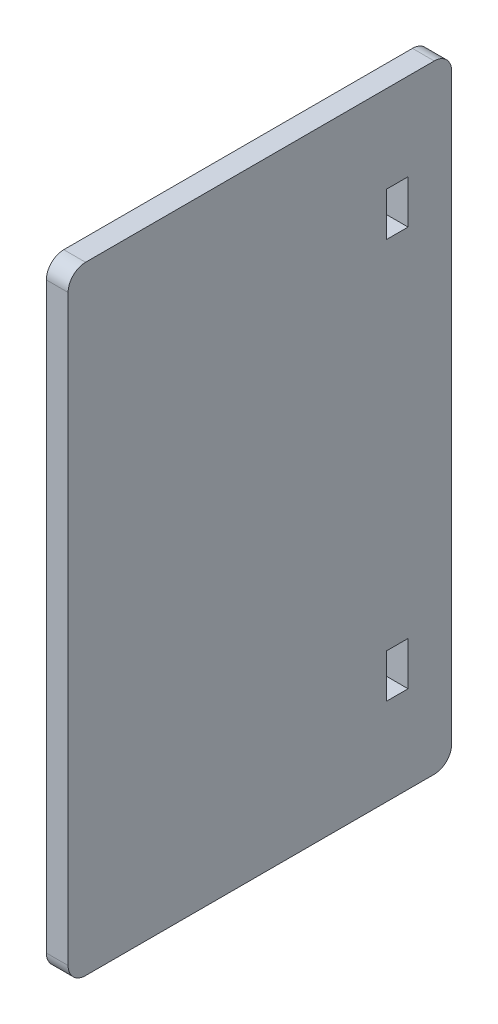
ISO-10303-21;
HEADER;
FILE_DESCRIPTION(('STEP AP214'),'2;1');
FILE_NAME('part.step','',(''),(''),'','','');
FILE_SCHEMA(('AUTOMOTIVE_DESIGN { 1 0 10303 214 1 1 1 1 }'));
ENDSEC;
DATA;
#1=APPLICATION_CONTEXT('core data for automotive mechanical design processes');
#2=APPLICATION_PROTOCOL_DEFINITION('international standard','automotive_design',2000,#1);
#3=PRODUCT_CONTEXT('',#1,'mechanical');
#4=PRODUCT('Part','Part','',(#3));
#5=PRODUCT_RELATED_PRODUCT_CATEGORY('part','',(#4));
#6=PRODUCT_DEFINITION_FORMATION('','',#4);
#7=PRODUCT_DEFINITION_CONTEXT('part definition',#1,'design');
#8=PRODUCT_DEFINITION('design','',#6,#7);
#9=PRODUCT_DEFINITION_SHAPE('','',#8);
#10=(LENGTH_UNIT() NAMED_UNIT(*) SI_UNIT(.MILLI.,.METRE.));
#11=(NAMED_UNIT(*) PLANE_ANGLE_UNIT() SI_UNIT($,.RADIAN.));
#12=(NAMED_UNIT(*) SI_UNIT($,.STERADIAN.) SOLID_ANGLE_UNIT());
#13=UNCERTAINTY_MEASURE_WITH_UNIT(LENGTH_MEASURE(1.E-05),#10,'distance_accuracy_value','');
#14=(GEOMETRIC_REPRESENTATION_CONTEXT(3) GLOBAL_UNCERTAINTY_ASSIGNED_CONTEXT((#13)) GLOBAL_UNIT_ASSIGNED_CONTEXT((#10,
#11,#12)) REPRESENTATION_CONTEXT('',''));
#15=CARTESIAN_POINT('',(0.,0.,0.));
#16=DIRECTION('',(0.,0.,1.));
#17=DIRECTION('',(1.,0.,0.));
#18=AXIS2_PLACEMENT_3D('',#15,#16,#17);
#19=CARTESIAN_POINT('',(3.175,-45.,27.9375));
#20=DIRECTION('',(0.,0.,-1.));
#21=DIRECTION('',(-1.,0.,0.));
#22=AXIS2_PLACEMENT_3D('',#19,#20,#21);
#23=PLANE('',#22);
#24=DIRECTION('',(0.,-1.,0.));
#25=VECTOR('',#24,1.);
#26=CARTESIAN_POINT('',(0.,-45.,27.9375));
#27=LINE('',#26,#25);
#28=CARTESIAN_POINT('',(0.,42.46,27.9375));
#29=VERTEX_POINT('',#28);
#30=CARTESIAN_POINT('',(0.,-42.46,27.9375));
#31=VERTEX_POINT('',#30);
#32=EDGE_CURVE('E195',#29,#31,#27,.T.);
#33=ORIENTED_EDGE('',*,*,#32,.T.);
#34=DIRECTION('',(-1.,0.,0.));
#35=VECTOR('',#34,1.);
#36=CARTESIAN_POINT('',(3.175,-42.46,27.9375));
#37=LINE('',#36,#35);
#38=CARTESIAN_POINT('',(3.175,-42.46,27.9375));
#39=VERTEX_POINT('',#38);
#40=EDGE_CURVE('E266',#31,#39,#37,.F.);
#41=ORIENTED_EDGE('',*,*,#40,.T.);
#42=DIRECTION('',(0.,-1.,0.));
#43=VECTOR('',#42,1.);
#44=CARTESIAN_POINT('',(3.175,-45.,27.9375));
#45=LINE('',#44,#43);
#46=CARTESIAN_POINT('',(3.175,42.46,27.9375));
#47=VERTEX_POINT('',#46);
#48=EDGE_CURVE('E230',#47,#39,#45,.T.);
#49=ORIENTED_EDGE('',*,*,#48,.F.);
#50=DIRECTION('',(-1.,0.,0.));
#51=VECTOR('',#50,1.);
#52=CARTESIAN_POINT('',(3.175,42.46,27.9375));
#53=LINE('',#52,#51);
#54=EDGE_CURVE('E263',#47,#29,#53,.T.);
#55=ORIENTED_EDGE('',*,*,#54,.T.);
#56=EDGE_LOOP('',(#33,#41,#49,#55));
#57=FACE_BOUND('',#56,.T.);
#58=ADVANCED_FACE('F40',(#57),#23,.F.);
#59=CARTESIAN_POINT('',(3.175,-45.,-27.9375));
#60=DIRECTION('',(0.,1.,0.));
#61=DIRECTION('',(0.,0.,1.));
#62=AXIS2_PLACEMENT_3D('',#59,#60,#61);
#63=PLANE('',#62);
#64=DIRECTION('',(0.,0.,-1.));
#65=VECTOR('',#64,1.);
#66=CARTESIAN_POINT('',(3.175,-45.,-27.9375));
#67=LINE('',#66,#65);
#68=CARTESIAN_POINT('',(3.175,-45.,25.3975));
#69=VERTEX_POINT('',#68);
#70=CARTESIAN_POINT('',(3.175,-45.,-25.3975));
#71=VERTEX_POINT('',#70);
#72=EDGE_CURVE('E233',#69,#71,#67,.T.);
#73=ORIENTED_EDGE('',*,*,#72,.F.);
#74=DIRECTION('',(-1.,0.,0.));
#75=VECTOR('',#74,1.);
#76=CARTESIAN_POINT('',(3.175,-45.,25.3975));
#77=LINE('',#76,#75);
#78=CARTESIAN_POINT('',(0.,-45.,25.3975));
#79=VERTEX_POINT('',#78);
#80=EDGE_CURVE('E252',#69,#79,#77,.T.);
#81=ORIENTED_EDGE('',*,*,#80,.T.);
#82=DIRECTION('',(0.,0.,-1.));
#83=VECTOR('',#82,1.);
#84=CARTESIAN_POINT('',(0.,-45.,-27.9375));
#85=LINE('',#84,#83);
#86=CARTESIAN_POINT('',(0.,-45.,-25.3975));
#87=VERTEX_POINT('',#86);
#88=EDGE_CURVE('E244',#79,#87,#85,.T.);
#89=ORIENTED_EDGE('',*,*,#88,.T.);
#90=DIRECTION('',(-1.,0.,0.));
#91=VECTOR('',#90,1.);
#92=CARTESIAN_POINT('',(3.175,-45.,-25.3975));
#93=LINE('',#92,#91);
#94=EDGE_CURVE('E241',#87,#71,#93,.F.);
#95=ORIENTED_EDGE('',*,*,#94,.T.);
#96=EDGE_LOOP('',(#73,#81,#89,#95));
#97=FACE_BOUND('',#96,.T.);
#98=ADVANCED_FACE('F308',(#97),#63,.F.);
#99=CARTESIAN_POINT('',(3.175,-45.,-27.9375));
#100=DIRECTION('',(0.,0.,1.));
#101=DIRECTION('',(1.,0.,0.));
#102=AXIS2_PLACEMENT_3D('',#99,#100,#101);
#103=PLANE('',#102);
#104=DIRECTION('',(0.,1.,0.));
#105=VECTOR('',#104,1.);
#106=CARTESIAN_POINT('',(3.175,-45.,-27.9375));
#107=LINE('',#106,#105);
#108=CARTESIAN_POINT('',(3.175,-42.46,-27.9375));
#109=VERTEX_POINT('',#108);
#110=CARTESIAN_POINT('',(3.175,42.46,-27.9375));
#111=VERTEX_POINT('',#110);
#112=EDGE_CURVE('E237',#109,#111,#107,.T.);
#113=ORIENTED_EDGE('',*,*,#112,.F.);
#114=DIRECTION('',(-1.,0.,0.));
#115=VECTOR('',#114,1.);
#116=CARTESIAN_POINT('',(3.175,-42.46,-27.9375));
#117=LINE('',#116,#115);
#118=CARTESIAN_POINT('',(0.,-42.46,-27.9375));
#119=VERTEX_POINT('',#118);
#120=EDGE_CURVE('E277',#109,#119,#117,.T.);
#121=ORIENTED_EDGE('',*,*,#120,.T.);
#122=DIRECTION('',(0.,1.,0.));
#123=VECTOR('',#122,1.);
#124=CARTESIAN_POINT('',(0.,-45.,-27.9375));
#125=LINE('',#124,#123);
#126=CARTESIAN_POINT('',(0.,42.46,-27.9375));
#127=VERTEX_POINT('',#126);
#128=EDGE_CURVE('E247',#119,#127,#125,.T.);
#129=ORIENTED_EDGE('',*,*,#128,.T.);
#130=DIRECTION('',(-1.,0.,0.));
#131=VECTOR('',#130,1.);
#132=CARTESIAN_POINT('',(3.175,42.46,-27.9375));
#133=LINE('',#132,#131);
#134=EDGE_CURVE('E275',#127,#111,#133,.F.);
#135=ORIENTED_EDGE('',*,*,#134,.T.);
#136=EDGE_LOOP('',(#113,#121,#129,#135));
#137=FACE_BOUND('',#136,.T.);
#138=ADVANCED_FACE('F283',(#137),#103,.F.);
#139=CARTESIAN_POINT('',(3.175,45.,-27.9375));
#140=DIRECTION('',(0.,-1.,0.));
#141=DIRECTION('',(0.,0.,-1.));
#142=AXIS2_PLACEMENT_3D('',#139,#140,#141);
#143=PLANE('',#142);
#144=DIRECTION('',(0.,0.,1.));
#145=VECTOR('',#144,1.);
#146=CARTESIAN_POINT('',(3.175,45.,-27.9375));
#147=LINE('',#146,#145);
#148=CARTESIAN_POINT('',(3.175,45.,-25.3975));
#149=VERTEX_POINT('',#148);
#150=CARTESIAN_POINT('',(3.175,45.,25.3975));
#151=VERTEX_POINT('',#150);
#152=EDGE_CURVE('E239',#149,#151,#147,.T.);
#153=ORIENTED_EDGE('',*,*,#152,.F.);
#154=DIRECTION('',(-1.,0.,0.));
#155=VECTOR('',#154,1.);
#156=CARTESIAN_POINT('',(3.175,45.,-25.3975));
#157=LINE('',#156,#155);
#158=CARTESIAN_POINT('',(0.,45.,-25.3975));
#159=VERTEX_POINT('',#158);
#160=EDGE_CURVE('E11',#149,#159,#157,.T.);
#161=ORIENTED_EDGE('',*,*,#160,.T.);
#162=DIRECTION('',(0.,0.,1.));
#163=VECTOR('',#162,1.);
#164=CARTESIAN_POINT('',(0.,45.,-27.9375));
#165=LINE('',#164,#163);
#166=CARTESIAN_POINT('',(0.,45.,25.3975));
#167=VERTEX_POINT('',#166);
#168=EDGE_CURVE('E234',#159,#167,#165,.T.);
#169=ORIENTED_EDGE('',*,*,#168,.T.);
#170=DIRECTION('',(-1.,0.,0.));
#171=VECTOR('',#170,1.);
#172=CARTESIAN_POINT('',(3.175,45.,25.3975));
#173=LINE('',#172,#171);
#174=EDGE_CURVE('E48',#167,#151,#173,.F.);
#175=ORIENTED_EDGE('',*,*,#174,.T.);
#176=EDGE_LOOP('',(#153,#161,#169,#175));
#177=FACE_BOUND('',#176,.T.);
#178=ADVANCED_FACE('F293',(#177),#143,.F.);
#179=CARTESIAN_POINT('',(3.175,0.,0.));
#180=DIRECTION('',(1.,0.,0.));
#181=DIRECTION('',(0.,0.,-1.));
#182=AXIS2_PLACEMENT_3D('',#179,#180,#181);
#183=PLANE('',#182);
#184=DIRECTION('',(0.,-1.,0.));
#185=VECTOR('',#184,1.);
#186=CARTESIAN_POINT('',(3.175,32.3,-18.4125));
#187=LINE('',#186,#185);
#188=CARTESIAN_POINT('',(3.175,32.3,-18.4125));
#189=VERTEX_POINT('',#188);
#190=CARTESIAN_POINT('',(3.175,25.95,-18.4125));
#191=VERTEX_POINT('',#190);
#192=EDGE_CURVE('E161',#189,#191,#187,.T.);
#193=ORIENTED_EDGE('',*,*,#192,.F.);
#194=DIRECTION('',(0.,0.,1.));
#195=VECTOR('',#194,1.);
#196=CARTESIAN_POINT('',(3.175,32.3,-18.4125));
#197=LINE('',#196,#195);
#198=CARTESIAN_POINT('',(3.175,32.3,-21.5875));
#199=VERTEX_POINT('',#198);
#200=EDGE_CURVE('E179',#199,#189,#197,.T.);
#201=ORIENTED_EDGE('',*,*,#200,.F.);
#202=DIRECTION('',(0.,1.,0.));
#203=VECTOR('',#202,1.);
#204=CARTESIAN_POINT('',(3.175,32.3,-21.5875));
#205=LINE('',#204,#203);
#206=CARTESIAN_POINT('',(3.175,25.95,-21.5875));
#207=VERTEX_POINT('',#206);
#208=EDGE_CURVE('E182',#207,#199,#205,.T.);
#209=ORIENTED_EDGE('',*,*,#208,.F.);
#210=DIRECTION('',(0.,0.,-1.));
#211=VECTOR('',#210,1.);
#212=CARTESIAN_POINT('',(3.175,25.95,-18.4125));
#213=LINE('',#212,#211);
#214=EDGE_CURVE('E188',#191,#207,#213,.T.);
#215=ORIENTED_EDGE('',*,*,#214,.F.);
#216=EDGE_LOOP('',(#193,#201,#209,#215));
#217=FACE_BOUND('',#216,.T.);
#218=DIRECTION('',(0.,-1.,0.));
#219=VECTOR('',#218,1.);
#220=CARTESIAN_POINT('',(3.175,-25.95,-18.4125));
#221=LINE('',#220,#219);
#222=CARTESIAN_POINT('',(3.175,-25.95,-18.4125));
#223=VERTEX_POINT('',#222);
#224=CARTESIAN_POINT('',(3.175,-32.3,-18.4125));
#225=VERTEX_POINT('',#224);
#226=EDGE_CURVE('E189',#223,#225,#221,.T.);
#227=ORIENTED_EDGE('',*,*,#226,.F.);
#228=DIRECTION('',(0.,0.,1.));
#229=VECTOR('',#228,1.);
#230=CARTESIAN_POINT('',(3.175,-25.95,-18.4125));
#231=LINE('',#230,#229);
#232=CARTESIAN_POINT('',(3.175,-25.95,-21.5875));
#233=VERTEX_POINT('',#232);
#234=EDGE_CURVE('E209',#233,#223,#231,.T.);
#235=ORIENTED_EDGE('',*,*,#234,.F.);
#236=DIRECTION('',(0.,1.,0.));
#237=VECTOR('',#236,1.);
#238=CARTESIAN_POINT('',(3.175,-25.95,-21.5875));
#239=LINE('',#238,#237);
#240=CARTESIAN_POINT('',(3.175,-32.3,-21.5875));
#241=VERTEX_POINT('',#240);
#242=EDGE_CURVE('E212',#241,#233,#239,.T.);
#243=ORIENTED_EDGE('',*,*,#242,.F.);
#244=DIRECTION('',(0.,0.,-1.));
#245=VECTOR('',#244,1.);
#246=CARTESIAN_POINT('',(3.175,-32.3,-18.4125));
#247=LINE('',#246,#245);
#248=EDGE_CURVE('E216',#225,#241,#247,.T.);
#249=ORIENTED_EDGE('',*,*,#248,.F.);
#250=EDGE_LOOP('',(#227,#235,#243,#249));
#251=FACE_BOUND('',#250,.T.);
#252=ORIENTED_EDGE('',*,*,#48,.T.);
#253=CARTESIAN_POINT('',(3.175,-42.46,25.3975));
#254=DIRECTION('',(1.,0.,0.));
#255=DIRECTION('',(0.,0.,-1.));
#256=AXIS2_PLACEMENT_3D('',#253,#254,#255);
#257=CIRCLE('',#256,2.54);
#258=EDGE_CURVE('E273',#39,#69,#257,.T.);
#259=ORIENTED_EDGE('',*,*,#258,.T.);
#260=ORIENTED_EDGE('',*,*,#72,.T.);
#261=CARTESIAN_POINT('',(3.175,-42.46,-25.3975));
#262=DIRECTION('',(1.,0.,0.));
#263=DIRECTION('',(0.,0.,-1.));
#264=AXIS2_PLACEMENT_3D('',#261,#262,#263);
#265=CIRCLE('',#264,2.54);
#266=EDGE_CURVE('E271',#71,#109,#265,.T.);
#267=ORIENTED_EDGE('',*,*,#266,.T.);
#268=ORIENTED_EDGE('',*,*,#112,.T.);
#269=CARTESIAN_POINT('',(3.175,42.46,-25.3975));
#270=DIRECTION('',(1.,0.,0.));
#271=DIRECTION('',(0.,0.,-1.));
#272=AXIS2_PLACEMENT_3D('',#269,#270,#271);
#273=CIRCLE('',#272,2.54);
#274=EDGE_CURVE('E61',#111,#149,#273,.T.);
#275=ORIENTED_EDGE('',*,*,#274,.T.);
#276=ORIENTED_EDGE('',*,*,#152,.T.);
#277=CARTESIAN_POINT('',(3.175,42.46,25.3975));
#278=DIRECTION('',(1.,0.,0.));
#279=DIRECTION('',(0.,0.,-1.));
#280=AXIS2_PLACEMENT_3D('',#277,#278,#279);
#281=CIRCLE('',#280,2.54);
#282=EDGE_CURVE('E268',#151,#47,#281,.T.);
#283=ORIENTED_EDGE('',*,*,#282,.T.);
#284=EDGE_LOOP('',(#252,#259,#260,#267,#268,#275,#276,#283));
#285=FACE_BOUND('',#284,.T.);
#286=ADVANCED_FACE('F295',(#217,#251,#285),#183,.T.);
#287=CARTESIAN_POINT('',(0.,0.,0.));
#288=DIRECTION('',(1.,0.,0.));
#289=DIRECTION('',(0.,0.,-1.));
#290=AXIS2_PLACEMENT_3D('',#287,#288,#289);
#291=PLANE('',#290);
#292=DIRECTION('',(0.,0.,1.));
#293=VECTOR('',#292,1.);
#294=CARTESIAN_POINT('',(0.,32.3,-18.4125));
#295=LINE('',#294,#293);
#296=CARTESIAN_POINT('',(0.,32.3,-21.5875));
#297=VERTEX_POINT('',#296);
#298=CARTESIAN_POINT('',(0.,32.3,-18.4125));
#299=VERTEX_POINT('',#298);
#300=EDGE_CURVE('E166',#297,#299,#295,.T.);
#301=ORIENTED_EDGE('',*,*,#300,.T.);
#302=DIRECTION('',(0.,-1.,0.));
#303=VECTOR('',#302,1.);
#304=CARTESIAN_POINT('',(0.,32.3,-18.4125));
#305=LINE('',#304,#303);
#306=CARTESIAN_POINT('',(0.,25.95,-18.4125));
#307=VERTEX_POINT('',#306);
#308=EDGE_CURVE('E158',#299,#307,#305,.T.);
#309=ORIENTED_EDGE('',*,*,#308,.T.);
#310=DIRECTION('',(0.,0.,-1.));
#311=VECTOR('',#310,1.);
#312=CARTESIAN_POINT('',(0.,25.95,-18.4125));
#313=LINE('',#312,#311);
#314=CARTESIAN_POINT('',(0.,25.95,-21.5875));
#315=VERTEX_POINT('',#314);
#316=EDGE_CURVE('E170',#307,#315,#313,.T.);
#317=ORIENTED_EDGE('',*,*,#316,.T.);
#318=DIRECTION('',(0.,1.,0.));
#319=VECTOR('',#318,1.);
#320=CARTESIAN_POINT('',(0.,32.3,-21.5875));
#321=LINE('',#320,#319);
#322=EDGE_CURVE('E174',#315,#297,#321,.T.);
#323=ORIENTED_EDGE('',*,*,#322,.T.);
#324=EDGE_LOOP('',(#301,#309,#317,#323));
#325=FACE_BOUND('',#324,.T.);
#326=DIRECTION('',(0.,0.,1.));
#327=VECTOR('',#326,1.);
#328=CARTESIAN_POINT('',(0.,-25.95,-18.4125));
#329=LINE('',#328,#327);
#330=CARTESIAN_POINT('',(0.,-25.95,-21.5875));
#331=VERTEX_POINT('',#330);
#332=CARTESIAN_POINT('',(0.,-25.95,-18.4125));
#333=VERTEX_POINT('',#332);
#334=EDGE_CURVE('E202',#331,#333,#329,.T.);
#335=ORIENTED_EDGE('',*,*,#334,.T.);
#336=DIRECTION('',(0.,-1.,0.));
#337=VECTOR('',#336,1.);
#338=CARTESIAN_POINT('',(0.,-25.95,-18.4125));
#339=LINE('',#338,#337);
#340=CARTESIAN_POINT('',(0.,-32.3,-18.4125));
#341=VERTEX_POINT('',#340);
#342=EDGE_CURVE('E213',#333,#341,#339,.T.);
#343=ORIENTED_EDGE('',*,*,#342,.T.);
#344=DIRECTION('',(0.,0.,-1.));
#345=VECTOR('',#344,1.);
#346=CARTESIAN_POINT('',(0.,-32.3,-18.4125));
#347=LINE('',#346,#345);
#348=CARTESIAN_POINT('',(0.,-32.3,-21.5875));
#349=VERTEX_POINT('',#348);
#350=EDGE_CURVE('E225',#341,#349,#347,.T.);
#351=ORIENTED_EDGE('',*,*,#350,.T.);
#352=DIRECTION('',(0.,1.,0.));
#353=VECTOR('',#352,1.);
#354=CARTESIAN_POINT('',(0.,-25.95,-21.5875));
#355=LINE('',#354,#353);
#356=EDGE_CURVE('E222',#349,#331,#355,.T.);
#357=ORIENTED_EDGE('',*,*,#356,.T.);
#358=EDGE_LOOP('',(#335,#343,#351,#357));
#359=FACE_BOUND('',#358,.T.);
#360=ORIENTED_EDGE('',*,*,#88,.F.);
#361=CARTESIAN_POINT('',(0.,-42.46,25.3975));
#362=DIRECTION('',(1.,0.,0.));
#363=DIRECTION('',(0.,0.,-1.));
#364=AXIS2_PLACEMENT_3D('',#361,#362,#363);
#365=CIRCLE('',#364,2.54);
#366=EDGE_CURVE('E261',#79,#31,#365,.F.);
#367=ORIENTED_EDGE('',*,*,#366,.T.);
#368=ORIENTED_EDGE('',*,*,#32,.F.);
#369=CARTESIAN_POINT('',(0.,42.46,25.3975));
#370=DIRECTION('',(1.,0.,0.));
#371=DIRECTION('',(0.,0.,-1.));
#372=AXIS2_PLACEMENT_3D('',#369,#370,#371);
#373=CIRCLE('',#372,2.54);
#374=EDGE_CURVE('E255',#29,#167,#373,.F.);
#375=ORIENTED_EDGE('',*,*,#374,.T.);
#376=ORIENTED_EDGE('',*,*,#168,.F.);
#377=CARTESIAN_POINT('',(0.,42.46,-25.3975));
#378=DIRECTION('',(1.,0.,0.));
#379=DIRECTION('',(0.,0.,-1.));
#380=AXIS2_PLACEMENT_3D('',#377,#378,#379);
#381=CIRCLE('',#380,2.54);
#382=EDGE_CURVE('E257',#159,#127,#381,.F.);
#383=ORIENTED_EDGE('',*,*,#382,.T.);
#384=ORIENTED_EDGE('',*,*,#128,.F.);
#385=CARTESIAN_POINT('',(0.,-42.46,-25.3975));
#386=DIRECTION('',(1.,0.,0.));
#387=DIRECTION('',(0.,0.,-1.));
#388=AXIS2_PLACEMENT_3D('',#385,#386,#387);
#389=CIRCLE('',#388,2.54);
#390=EDGE_CURVE('E259',#119,#87,#389,.F.);
#391=ORIENTED_EDGE('',*,*,#390,.T.);
#392=EDGE_LOOP('',(#360,#367,#368,#375,#376,#383,#384,#391));
#393=FACE_BOUND('',#392,.T.);
#394=ADVANCED_FACE('F176',(#325,#359,#393),#291,.F.);
#395=CARTESIAN_POINT('',(0.,-25.95,-18.4125));
#396=DIRECTION('',(0.,0.,1.));
#397=DIRECTION('',(1.,0.,0.));
#398=AXIS2_PLACEMENT_3D('',#395,#396,#397);
#399=PLANE('',#398);
#400=ORIENTED_EDGE('',*,*,#226,.T.);
#401=DIRECTION('',(1.,0.,0.));
#402=VECTOR('',#401,1.);
#403=CARTESIAN_POINT('',(0.,-32.3,-18.4125));
#404=LINE('',#403,#402);
#405=EDGE_CURVE('E199',#341,#225,#404,.T.);
#406=ORIENTED_EDGE('',*,*,#405,.F.);
#407=ORIENTED_EDGE('',*,*,#342,.F.);
#408=DIRECTION('',(1.,0.,0.));
#409=VECTOR('',#408,1.);
#410=CARTESIAN_POINT('',(0.,-25.95,-18.4125));
#411=LINE('',#410,#409);
#412=EDGE_CURVE('E207',#333,#223,#411,.T.);
#413=ORIENTED_EDGE('',*,*,#412,.T.);
#414=EDGE_LOOP('',(#400,#406,#407,#413));
#415=FACE_BOUND('',#414,.T.);
#416=ADVANCED_FACE('F331',(#415),#399,.F.);
#417=CARTESIAN_POINT('',(0.,-25.95,-18.4125));
#418=DIRECTION('',(0.,1.,0.));
#419=DIRECTION('',(0.,0.,1.));
#420=AXIS2_PLACEMENT_3D('',#417,#418,#419);
#421=PLANE('',#420);
#422=ORIENTED_EDGE('',*,*,#234,.T.);
#423=ORIENTED_EDGE('',*,*,#412,.F.);
#424=ORIENTED_EDGE('',*,*,#334,.F.);
#425=DIRECTION('',(1.,0.,0.));
#426=VECTOR('',#425,1.);
#427=CARTESIAN_POINT('',(0.,-25.95,-21.5875));
#428=LINE('',#427,#426);
#429=EDGE_CURVE('E205',#331,#233,#428,.T.);
#430=ORIENTED_EDGE('',*,*,#429,.T.);
#431=EDGE_LOOP('',(#422,#423,#424,#430));
#432=FACE_BOUND('',#431,.T.);
#433=ADVANCED_FACE('F335',(#432),#421,.F.);
#434=CARTESIAN_POINT('',(0.,-25.95,-21.5875));
#435=DIRECTION('',(0.,0.,-1.));
#436=DIRECTION('',(-1.,0.,0.));
#437=AXIS2_PLACEMENT_3D('',#434,#435,#436);
#438=PLANE('',#437);
#439=ORIENTED_EDGE('',*,*,#242,.T.);
#440=ORIENTED_EDGE('',*,*,#429,.F.);
#441=ORIENTED_EDGE('',*,*,#356,.F.);
#442=DIRECTION('',(1.,0.,0.));
#443=VECTOR('',#442,1.);
#444=CARTESIAN_POINT('',(0.,-32.3,-21.5875));
#445=LINE('',#444,#443);
#446=EDGE_CURVE('E203',#349,#241,#445,.T.);
#447=ORIENTED_EDGE('',*,*,#446,.T.);
#448=EDGE_LOOP('',(#439,#440,#441,#447));
#449=FACE_BOUND('',#448,.T.);
#450=ADVANCED_FACE('F338',(#449),#438,.F.);
#451=CARTESIAN_POINT('',(0.,-32.3,-18.4125));
#452=DIRECTION('',(0.,-1.,0.));
#453=DIRECTION('',(0.,0.,-1.));
#454=AXIS2_PLACEMENT_3D('',#451,#452,#453);
#455=PLANE('',#454);
#456=ORIENTED_EDGE('',*,*,#248,.T.);
#457=ORIENTED_EDGE('',*,*,#446,.F.);
#458=ORIENTED_EDGE('',*,*,#350,.F.);
#459=ORIENTED_EDGE('',*,*,#405,.T.);
#460=EDGE_LOOP('',(#456,#457,#458,#459));
#461=FACE_BOUND('',#460,.T.);
#462=ADVANCED_FACE('F342',(#461),#455,.F.);
#463=CARTESIAN_POINT('',(0.,32.3,-18.4125));
#464=DIRECTION('',(0.,0.,1.));
#465=DIRECTION('',(1.,0.,0.));
#466=AXIS2_PLACEMENT_3D('',#463,#464,#465);
#467=PLANE('',#466);
#468=ORIENTED_EDGE('',*,*,#192,.T.);
#469=DIRECTION('',(1.,0.,0.));
#470=VECTOR('',#469,1.);
#471=CARTESIAN_POINT('',(0.,25.95,-18.4125));
#472=LINE('',#471,#470);
#473=EDGE_CURVE('E154',#307,#191,#472,.T.);
#474=ORIENTED_EDGE('',*,*,#473,.F.);
#475=ORIENTED_EDGE('',*,*,#308,.F.);
#476=DIRECTION('',(1.,0.,0.));
#477=VECTOR('',#476,1.);
#478=CARTESIAN_POINT('',(0.,32.3,-18.4125));
#479=LINE('',#478,#477);
#480=EDGE_CURVE('E193',#299,#189,#479,.T.);
#481=ORIENTED_EDGE('',*,*,#480,.T.);
#482=EDGE_LOOP('',(#468,#474,#475,#481));
#483=FACE_BOUND('',#482,.T.);
#484=ADVANCED_FACE('F156',(#483),#467,.F.);
#485=CARTESIAN_POINT('',(0.,32.3,-18.4125));
#486=DIRECTION('',(0.,1.,0.));
#487=DIRECTION('',(0.,0.,1.));
#488=AXIS2_PLACEMENT_3D('',#485,#486,#487);
#489=PLANE('',#488);
#490=ORIENTED_EDGE('',*,*,#200,.T.);
#491=ORIENTED_EDGE('',*,*,#480,.F.);
#492=ORIENTED_EDGE('',*,*,#300,.F.);
#493=DIRECTION('',(1.,0.,0.));
#494=VECTOR('',#493,1.);
#495=CARTESIAN_POINT('',(0.,32.3,-21.5875));
#496=LINE('',#495,#494);
#497=EDGE_CURVE('E196',#297,#199,#496,.T.);
#498=ORIENTED_EDGE('',*,*,#497,.T.);
#499=EDGE_LOOP('',(#490,#491,#492,#498));
#500=FACE_BOUND('',#499,.T.);
#501=ADVANCED_FACE('F352',(#500),#489,.F.);
#502=CARTESIAN_POINT('',(0.,32.3,-21.5875));
#503=DIRECTION('',(0.,0.,-1.));
#504=DIRECTION('',(0.,1.,0.));
#505=AXIS2_PLACEMENT_3D('',#502,#503,#504);
#506=PLANE('',#505);
#507=ORIENTED_EDGE('',*,*,#208,.T.);
#508=ORIENTED_EDGE('',*,*,#497,.F.);
#509=ORIENTED_EDGE('',*,*,#322,.F.);
#510=DIRECTION('',(1.,0.,0.));
#511=VECTOR('',#510,1.);
#512=CARTESIAN_POINT('',(0.,25.95,-21.5875));
#513=LINE('',#512,#511);
#514=EDGE_CURVE('E165',#315,#207,#513,.T.);
#515=ORIENTED_EDGE('',*,*,#514,.T.);
#516=EDGE_LOOP('',(#507,#508,#509,#515));
#517=FACE_BOUND('',#516,.T.);
#518=ADVANCED_FACE('F355',(#517),#506,.F.);
#519=CARTESIAN_POINT('',(0.,25.95,-18.4125));
#520=DIRECTION('',(0.,-1.,0.));
#521=DIRECTION('',(0.,0.,-1.));
#522=AXIS2_PLACEMENT_3D('',#519,#520,#521);
#523=PLANE('',#522);
#524=ORIENTED_EDGE('',*,*,#214,.T.);
#525=ORIENTED_EDGE('',*,*,#514,.F.);
#526=ORIENTED_EDGE('',*,*,#316,.F.);
#527=ORIENTED_EDGE('',*,*,#473,.T.);
#528=EDGE_LOOP('',(#524,#525,#526,#527));
#529=FACE_BOUND('',#528,.T.);
#530=ADVANCED_FACE('F171',(#529),#523,.F.);
#531=CARTESIAN_POINT('',(3.175,-42.46,25.3975));
#532=DIRECTION('',(-1.,0.,0.));
#533=DIRECTION('',(0.,0.,1.));
#534=AXIS2_PLACEMENT_3D('',#531,#532,#533);
#535=CYLINDRICAL_SURFACE('',#534,2.54);
#536=ORIENTED_EDGE('',*,*,#258,.F.);
#537=ORIENTED_EDGE('',*,*,#40,.F.);
#538=ORIENTED_EDGE('',*,*,#366,.F.);
#539=ORIENTED_EDGE('',*,*,#80,.F.);
#540=EDGE_LOOP('',(#536,#537,#538,#539));
#541=FACE_BOUND('',#540,.T.);
#542=ADVANCED_FACE('F305',(#541),#535,.T.);
#543=CARTESIAN_POINT('',(3.175,-42.46,-25.3975));
#544=DIRECTION('',(-1.,0.,0.));
#545=DIRECTION('',(0.,0.,1.));
#546=AXIS2_PLACEMENT_3D('',#543,#544,#545);
#547=CYLINDRICAL_SURFACE('',#546,2.54);
#548=ORIENTED_EDGE('',*,*,#266,.F.);
#549=ORIENTED_EDGE('',*,*,#94,.F.);
#550=ORIENTED_EDGE('',*,*,#390,.F.);
#551=ORIENTED_EDGE('',*,*,#120,.F.);
#552=EDGE_LOOP('',(#548,#549,#550,#551));
#553=FACE_BOUND('',#552,.T.);
#554=ADVANCED_FACE('F310',(#553),#547,.T.);
#555=CARTESIAN_POINT('',(3.175,42.46,-25.3975));
#556=DIRECTION('',(-1.,0.,0.));
#557=DIRECTION('',(0.,0.,1.));
#558=AXIS2_PLACEMENT_3D('',#555,#556,#557);
#559=CYLINDRICAL_SURFACE('',#558,2.54);
#560=ORIENTED_EDGE('',*,*,#274,.F.);
#561=ORIENTED_EDGE('',*,*,#134,.F.);
#562=ORIENTED_EDGE('',*,*,#382,.F.);
#563=ORIENTED_EDGE('',*,*,#160,.F.);
#564=EDGE_LOOP('',(#560,#561,#562,#563));
#565=FACE_BOUND('',#564,.T.);
#566=ADVANCED_FACE('F292',(#565),#559,.T.);
#567=CARTESIAN_POINT('',(3.175,42.46,25.3975));
#568=DIRECTION('',(-1.,0.,0.));
#569=DIRECTION('',(0.,0.,1.));
#570=AXIS2_PLACEMENT_3D('',#567,#568,#569);
#571=CYLINDRICAL_SURFACE('',#570,2.54);
#572=ORIENTED_EDGE('',*,*,#282,.F.);
#573=ORIENTED_EDGE('',*,*,#174,.F.);
#574=ORIENTED_EDGE('',*,*,#374,.F.);
#575=ORIENTED_EDGE('',*,*,#54,.F.);
#576=EDGE_LOOP('',(#572,#573,#574,#575));
#577=FACE_BOUND('',#576,.T.);
#578=ADVANCED_FACE('F42',(#577),#571,.T.);
#579=CLOSED_SHELL('',(#58,#98,#138,#178,#286,#394,#416,#433,#450,#462,#484,#501,#518,#530,#542,
#554,#566,#578));
#580=MANIFOLD_SOLID_BREP('B2',#579);
#581=ADVANCED_BREP_SHAPE_REPRESENTATION('',(#18,#580),#14);
#582=SHAPE_DEFINITION_REPRESENTATION(#9,#581);
ENDSEC;
END-ISO-10303-21;
